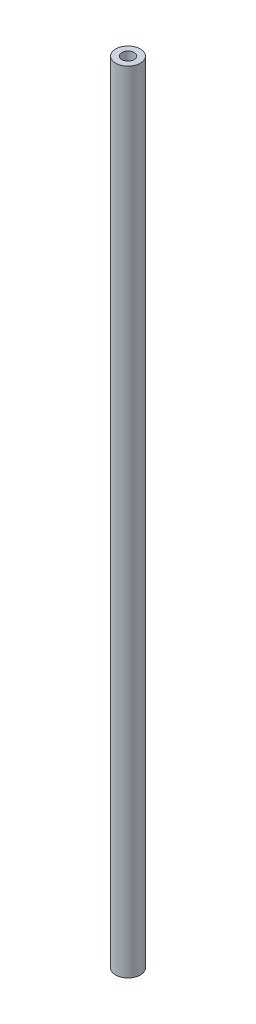
ISO-10303-21;
HEADER;
FILE_DESCRIPTION(('STEP AP214'),'2;1');
FILE_NAME('part.step','',(''),(''),'','','');
FILE_SCHEMA(('AUTOMOTIVE_DESIGN { 1 0 10303 214 1 1 1 1 }'));
ENDSEC;
DATA;
#1=APPLICATION_CONTEXT('core data for automotive mechanical design processes');
#2=APPLICATION_PROTOCOL_DEFINITION('international standard','automotive_design',2000,#1);
#3=PRODUCT_CONTEXT('',#1,'mechanical');
#4=PRODUCT('Part','Part','',(#3));
#5=PRODUCT_RELATED_PRODUCT_CATEGORY('part','',(#4));
#6=PRODUCT_DEFINITION_FORMATION('','',#4);
#7=PRODUCT_DEFINITION_CONTEXT('part definition',#1,'design');
#8=PRODUCT_DEFINITION('design','',#6,#7);
#9=PRODUCT_DEFINITION_SHAPE('','',#8);
#10=(LENGTH_UNIT() NAMED_UNIT(*) SI_UNIT(.MILLI.,.METRE.));
#11=(NAMED_UNIT(*) PLANE_ANGLE_UNIT() SI_UNIT($,.RADIAN.));
#12=(NAMED_UNIT(*) SI_UNIT($,.STERADIAN.) SOLID_ANGLE_UNIT());
#13=UNCERTAINTY_MEASURE_WITH_UNIT(LENGTH_MEASURE(1.E-05),#10,'distance_accuracy_value','');
#14=(GEOMETRIC_REPRESENTATION_CONTEXT(3) GLOBAL_UNCERTAINTY_ASSIGNED_CONTEXT((#13)) GLOBAL_UNIT_ASSIGNED_CONTEXT((#10,
#11,#12)) REPRESENTATION_CONTEXT('',''));
#15=CARTESIAN_POINT('',(0.,0.,0.));
#16=DIRECTION('',(0.,0.,1.));
#17=DIRECTION('',(1.,0.,0.));
#18=AXIS2_PLACEMENT_3D('',#15,#16,#17);
#19=CARTESIAN_POINT('',(0.,203.2,0.));
#20=DIRECTION('',(0.,1.,0.));
#21=DIRECTION('',(0.,0.,1.));
#22=AXIS2_PLACEMENT_3D('',#19,#20,#21);
#23=PLANE('',#22);
#24=CARTESIAN_POINT('',(0.,203.2,0.));
#25=DIRECTION('',(0.,1.,0.));
#26=DIRECTION('',(0.,0.,1.));
#27=AXIS2_PLACEMENT_3D('',#24,#25,#26);
#28=CIRCLE('',#27,3.175);
#29=CARTESIAN_POINT('',(0.,203.2,3.175));
#30=VERTEX_POINT('',#29);
#31=EDGE_CURVE('E10',#30,#30,#28,.T.);
#32=ORIENTED_EDGE('',*,*,#31,.T.);
#33=EDGE_LOOP('',(#32));
#34=FACE_BOUND('',#33,.T.);
#35=CARTESIAN_POINT('',(0.,203.2,0.));
#36=DIRECTION('',(0.,1.,0.));
#37=DIRECTION('',(0.,0.,1.));
#38=AXIS2_PLACEMENT_3D('',#35,#36,#37);
#39=CIRCLE('',#38,1.5875);
#40=CARTESIAN_POINT('',(0.,203.2,1.5875));
#41=VERTEX_POINT('',#40);
#42=EDGE_CURVE('E41',#41,#41,#39,.T.);
#43=ORIENTED_EDGE('',*,*,#42,.F.);
#44=EDGE_LOOP('',(#43));
#45=FACE_BOUND('',#44,.T.);
#46=ADVANCED_FACE('F30',(#34,#45),#23,.T.);
#47=CARTESIAN_POINT('',(0.,0.,0.));
#48=DIRECTION('',(0.,1.,0.));
#49=DIRECTION('',(0.,0.,1.));
#50=AXIS2_PLACEMENT_3D('',#47,#48,#49);
#51=PLANE('',#50);
#52=CARTESIAN_POINT('',(0.,0.,0.));
#53=DIRECTION('',(0.,1.,0.));
#54=DIRECTION('',(0.,0.,1.));
#55=AXIS2_PLACEMENT_3D('',#52,#53,#54);
#56=CIRCLE('',#55,3.175);
#57=CARTESIAN_POINT('',(0.,0.,3.175));
#58=VERTEX_POINT('',#57);
#59=EDGE_CURVE('E34',#58,#58,#56,.T.);
#60=ORIENTED_EDGE('',*,*,#59,.F.);
#61=EDGE_LOOP('',(#60));
#62=FACE_BOUND('',#61,.T.);
#63=CARTESIAN_POINT('',(0.,0.,0.));
#64=DIRECTION('',(0.,1.,0.));
#65=DIRECTION('',(0.,0.,1.));
#66=AXIS2_PLACEMENT_3D('',#63,#64,#65);
#67=CIRCLE('',#66,1.5875);
#68=CARTESIAN_POINT('',(0.,0.,1.5875));
#69=VERTEX_POINT('',#68);
#70=EDGE_CURVE('E43',#69,#69,#67,.T.);
#71=ORIENTED_EDGE('',*,*,#70,.T.);
#72=EDGE_LOOP('',(#71));
#73=FACE_BOUND('',#72,.T.);
#74=ADVANCED_FACE('F53',(#62,#73),#51,.F.);
#75=CARTESIAN_POINT('',(0.,203.2,0.));
#76=DIRECTION('',(0.,-1.,0.));
#77=DIRECTION('',(0.,0.,-1.));
#78=AXIS2_PLACEMENT_3D('',#75,#76,#77);
#79=CYLINDRICAL_SURFACE('',#78,3.175);
#80=ORIENTED_EDGE('',*,*,#31,.F.);
#81=EDGE_LOOP('',(#80));
#82=FACE_BOUND('',#81,.T.);
#83=ORIENTED_EDGE('',*,*,#59,.T.);
#84=EDGE_LOOP('',(#83));
#85=FACE_BOUND('',#84,.T.);
#86=ADVANCED_FACE('F32',(#82,#85),#79,.T.);
#87=CARTESIAN_POINT('',(0.,203.2,0.));
#88=DIRECTION('',(0.,-1.,0.));
#89=DIRECTION('',(0.,0.,-1.));
#90=AXIS2_PLACEMENT_3D('',#87,#88,#89);
#91=CYLINDRICAL_SURFACE('',#90,1.5875);
#92=ORIENTED_EDGE('',*,*,#42,.T.);
#93=EDGE_LOOP('',(#92));
#94=FACE_BOUND('',#93,.T.);
#95=ORIENTED_EDGE('',*,*,#70,.F.);
#96=EDGE_LOOP('',(#95));
#97=FACE_BOUND('',#96,.T.);
#98=ADVANCED_FACE('F49',(#94,#97),#91,.F.);
#99=CLOSED_SHELL('',(#46,#74,#86,#98));
#100=MANIFOLD_SOLID_BREP('B2',#99);
#101=ADVANCED_BREP_SHAPE_REPRESENTATION('',(#18,#100),#14);
#102=SHAPE_DEFINITION_REPRESENTATION(#9,#101);
ENDSEC;
END-ISO-10303-21;
